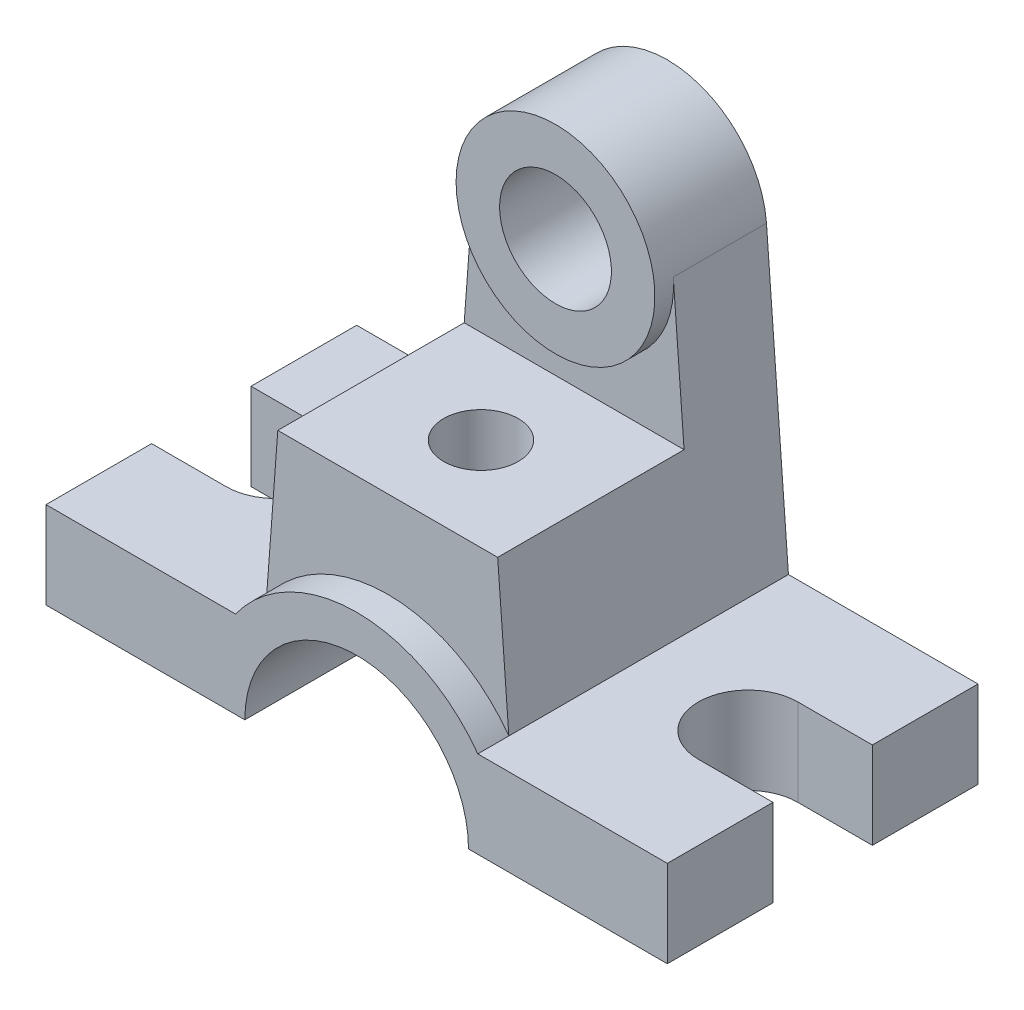
ISO-10303-21;
HEADER;
FILE_DESCRIPTION(('STEP AP214'),'2;1');
FILE_NAME('part.step','',(''),(''),'','','');
FILE_SCHEMA(('AUTOMOTIVE_DESIGN { 1 0 10303 214 1 1 1 1 }'));
ENDSEC;
DATA;
#1=APPLICATION_CONTEXT('core data for automotive mechanical design processes');
#2=APPLICATION_PROTOCOL_DEFINITION('international standard','automotive_design',2000,#1);
#3=PRODUCT_CONTEXT('',#1,'mechanical');
#4=PRODUCT('Part','Part','',(#3));
#5=PRODUCT_RELATED_PRODUCT_CATEGORY('part','',(#4));
#6=PRODUCT_DEFINITION_FORMATION('','',#4);
#7=PRODUCT_DEFINITION_CONTEXT('part definition',#1,'design');
#8=PRODUCT_DEFINITION('design','',#6,#7);
#9=PRODUCT_DEFINITION_SHAPE('','',#8);
#10=(LENGTH_UNIT() NAMED_UNIT(*) SI_UNIT(.MILLI.,.METRE.));
#11=(NAMED_UNIT(*) PLANE_ANGLE_UNIT() SI_UNIT($,.RADIAN.));
#12=(NAMED_UNIT(*) SI_UNIT($,.STERADIAN.) SOLID_ANGLE_UNIT());
#13=UNCERTAINTY_MEASURE_WITH_UNIT(LENGTH_MEASURE(1.E-05),#10,'distance_accuracy_value','');
#14=(GEOMETRIC_REPRESENTATION_CONTEXT(3) GLOBAL_UNCERTAINTY_ASSIGNED_CONTEXT((#13)) GLOBAL_UNIT_ASSIGNED_CONTEXT((#10,
#11,#12)) REPRESENTATION_CONTEXT('',''));
#15=CARTESIAN_POINT('',(0.,0.,0.));
#16=DIRECTION('',(0.,0.,1.));
#17=DIRECTION('',(1.,0.,0.));
#18=AXIS2_PLACEMENT_3D('',#15,#16,#17);
#19=CARTESIAN_POINT('',(0.,0.,-50.));
#20=DIRECTION('',(0.,0.,1.));
#21=DIRECTION('',(1.,0.,0.));
#22=AXIS2_PLACEMENT_3D('',#19,#20,#21);
#23=CYLINDRICAL_SURFACE('',#22,24.);
#24=DIRECTION('',(0.,0.,1.));
#25=VECTOR('',#24,1.);
#26=CARTESIAN_POINT('',(19.4935886896179,14.,-50.));
#27=LINE('',#26,#25);
#28=CARTESIAN_POINT('',(19.4935886896179,14.,-5.));
#29=VERTEX_POINT('',#28);
#30=CARTESIAN_POINT('',(19.4935886896179,14.,0.));
#31=VERTEX_POINT('',#30);
#32=EDGE_CURVE('E409',#29,#31,#27,.T.);
#33=ORIENTED_EDGE('',*,*,#32,.F.);
#34=CARTESIAN_POINT('',(0.,0.,-5.));
#35=DIRECTION('',(0.,0.,-1.));
#36=DIRECTION('',(-1.,0.,0.));
#37=AXIS2_PLACEMENT_3D('',#34,#35,#36);
#38=CIRCLE('',#37,24.);
#39=CARTESIAN_POINT('',(-19.4935886896179,14.,-5.));
#40=VERTEX_POINT('',#39);
#41=EDGE_CURVE('E200',#40,#29,#38,.T.);
#42=ORIENTED_EDGE('',*,*,#41,.F.);
#43=DIRECTION('',(0.,0.,1.));
#44=VECTOR('',#43,1.);
#45=CARTESIAN_POINT('',(-19.4935886896179,14.,-50.));
#46=LINE('',#45,#44);
#47=CARTESIAN_POINT('',(-19.4935886896179,14.,0.));
#48=VERTEX_POINT('',#47);
#49=EDGE_CURVE('E406',#40,#48,#46,.T.);
#50=ORIENTED_EDGE('',*,*,#49,.T.);
#51=CARTESIAN_POINT('',(0.,0.,0.));
#52=DIRECTION('',(0.,0.,1.));
#53=DIRECTION('',(-1.,0.,0.));
#54=AXIS2_PLACEMENT_3D('',#51,#52,#53);
#55=CIRCLE('',#54,24.);
#56=EDGE_CURVE('E391',#31,#48,#55,.T.);
#57=ORIENTED_EDGE('',*,*,#56,.F.);
#58=EDGE_LOOP('',(#33,#42,#50,#57));
#59=FACE_BOUND('',#58,.T.);
#60=ADVANCED_FACE('F47',(#59),#23,.T.);
#61=CARTESIAN_POINT('',(0.,0.,-35.));
#62=DIRECTION('',(0.,0.,-1.));
#63=DIRECTION('',(-1.,0.,0.));
#64=AXIS2_PLACEMENT_3D('',#61,#62,#63);
#65=PLANE('',#64);
#66=DIRECTION('',(-1.,0.,0.));
#67=VECTOR('',#66,1.);
#68=CARTESIAN_POINT('',(0.,38.,-35.));
#69=LINE('',#68,#67);
#70=CARTESIAN_POINT('',(17.6942742704479,38.,-35.));
#71=VERTEX_POINT('',#70);
#72=CARTESIAN_POINT('',(-17.6942742704479,38.,-35.));
#73=VERTEX_POINT('',#72);
#74=EDGE_CURVE('E11',#71,#73,#69,.T.);
#75=ORIENTED_EDGE('',*,*,#74,.F.);
#76=DIRECTION('',(-0.0747616216240642,0.997201433980187,0.));
#77=VECTOR('',#76,1.);
#78=CARTESIAN_POINT('',(20.428366721095,1.53154395005661,-35.));
#79=LINE('',#78,#77);
#80=CARTESIAN_POINT('',(15.955222943683,61.196185945985,-35.));
#81=VERTEX_POINT('',#80);
#82=EDGE_CURVE('E208',#71,#81,#79,.T.);
#83=ORIENTED_EDGE('',*,*,#82,.T.);
#84=CARTESIAN_POINT('',(0.,60.,-35.));
#85=DIRECTION('',(0.,0.,-1.));
#86=DIRECTION('',(-1.,0.,0.));
#87=AXIS2_PLACEMENT_3D('',#84,#85,#86);
#88=CIRCLE('',#87,16.);
#89=CARTESIAN_POINT('',(-15.955222943683,61.196185945985,-35.));
#90=VERTEX_POINT('',#89);
#91=EDGE_CURVE('E247',#81,#90,#88,.T.);
#92=ORIENTED_EDGE('',*,*,#91,.T.);
#93=DIRECTION('',(0.0747616216240642,0.997201433980187,0.));
#94=VECTOR('',#93,1.);
#95=CARTESIAN_POINT('',(-20.428366721095,1.53154395005661,-35.));
#96=LINE('',#95,#94);
#97=EDGE_CURVE('E268',#73,#90,#96,.T.);
#98=ORIENTED_EDGE('',*,*,#97,.F.);
#99=EDGE_LOOP('',(#75,#83,#92,#98));
#100=FACE_BOUND('',#99,.T.);
#101=ADVANCED_FACE('F511',(#100),#65,.F.);
#102=CARTESIAN_POINT('',(-50.,0.,-50.));
#103=DIRECTION('',(-1.,0.,0.));
#104=DIRECTION('',(0.,0.,1.));
#105=AXIS2_PLACEMENT_3D('',#102,#103,#104);
#106=PLANE('',#105);
#107=DIRECTION('',(0.,-1.,0.));
#108=VECTOR('',#107,1.);
#109=CARTESIAN_POINT('',(-50.,0.,-33.));
#110=LINE('',#109,#108);
#111=CARTESIAN_POINT('',(-50.,14.,-33.));
#112=VERTEX_POINT('',#111);
#113=CARTESIAN_POINT('',(-50.,0.,-33.));
#114=VERTEX_POINT('',#113);
#115=EDGE_CURVE('E329',#112,#114,#110,.T.);
#116=ORIENTED_EDGE('',*,*,#115,.F.);
#117=DIRECTION('',(0.,0.,1.));
#118=VECTOR('',#117,1.);
#119=CARTESIAN_POINT('',(-50.,14.,-50.));
#120=LINE('',#119,#118);
#121=CARTESIAN_POINT('',(-50.,14.,-50.));
#122=VERTEX_POINT('',#121);
#123=EDGE_CURVE('E398',#122,#112,#120,.T.);
#124=ORIENTED_EDGE('',*,*,#123,.F.);
#125=DIRECTION('',(0.,-1.,0.));
#126=VECTOR('',#125,1.);
#127=CARTESIAN_POINT('',(-50.,0.,-50.));
#128=LINE('',#127,#126);
#129=CARTESIAN_POINT('',(-50.,0.,-50.));
#130=VERTEX_POINT('',#129);
#131=EDGE_CURVE('E339',#122,#130,#128,.T.);
#132=ORIENTED_EDGE('',*,*,#131,.T.);
#133=DIRECTION('',(0.,0.,1.));
#134=VECTOR('',#133,1.);
#135=CARTESIAN_POINT('',(-50.,0.,-50.));
#136=LINE('',#135,#134);
#137=EDGE_CURVE('E426',#130,#114,#136,.T.);
#138=ORIENTED_EDGE('',*,*,#137,.T.);
#139=EDGE_LOOP('',(#116,#124,#132,#138));
#140=FACE_BOUND('',#139,.T.);
#141=ADVANCED_FACE('F461',(#140),#106,.T.);
#142=CARTESIAN_POINT('',(50.,0.,-50.));
#143=DIRECTION('',(1.,0.,0.));
#144=DIRECTION('',(0.,0.,-1.));
#145=AXIS2_PLACEMENT_3D('',#142,#143,#144);
#146=PLANE('',#145);
#147=DIRECTION('',(0.,-1.,0.));
#148=VECTOR('',#147,1.);
#149=CARTESIAN_POINT('',(50.,0.,-17.));
#150=LINE('',#149,#148);
#151=CARTESIAN_POINT('',(50.,14.,-17.));
#152=VERTEX_POINT('',#151);
#153=CARTESIAN_POINT('',(50.,0.,-17.));
#154=VERTEX_POINT('',#153);
#155=EDGE_CURVE('E335',#152,#154,#150,.T.);
#156=ORIENTED_EDGE('',*,*,#155,.F.);
#157=DIRECTION('',(0.,0.,1.));
#158=VECTOR('',#157,1.);
#159=CARTESIAN_POINT('',(50.,14.,-50.));
#160=LINE('',#159,#158);
#161=CARTESIAN_POINT('',(50.,14.,0.));
#162=VERTEX_POINT('',#161);
#163=EDGE_CURVE('E414',#152,#162,#160,.T.);
#164=ORIENTED_EDGE('',*,*,#163,.T.);
#165=DIRECTION('',(0.,1.,0.));
#166=VECTOR('',#165,1.);
#167=CARTESIAN_POINT('',(50.,0.,0.));
#168=LINE('',#167,#166);
#169=CARTESIAN_POINT('',(50.,0.,0.));
#170=VERTEX_POINT('',#169);
#171=EDGE_CURVE('E383',#170,#162,#168,.T.);
#172=ORIENTED_EDGE('',*,*,#171,.F.);
#173=DIRECTION('',(0.,0.,1.));
#174=VECTOR('',#173,1.);
#175=CARTESIAN_POINT('',(50.,0.,-50.));
#176=LINE('',#175,#174);
#177=EDGE_CURVE('E419',#154,#170,#176,.T.);
#178=ORIENTED_EDGE('',*,*,#177,.F.);
#179=EDGE_LOOP('',(#156,#164,#172,#178));
#180=FACE_BOUND('',#179,.T.);
#181=ADVANCED_FACE('F485',(#180),#146,.T.);
#182=DIRECTION('',(0.,1.,0.));
#183=VECTOR('',#182,1.);
#184=CARTESIAN_POINT('',(-50.,0.,-17.));
#185=LINE('',#184,#183);
#186=CARTESIAN_POINT('',(-50.,0.,-17.));
#187=VERTEX_POINT('',#186);
#188=CARTESIAN_POINT('',(-50.,14.,-17.));
#189=VERTEX_POINT('',#188);
#190=EDGE_CURVE('E300',#187,#189,#185,.T.);
#191=ORIENTED_EDGE('',*,*,#190,.F.);
#192=CARTESIAN_POINT('',(-50.,0.,0.));
#193=VERTEX_POINT('',#192);
#194=EDGE_CURVE('E367',#187,#193,#136,.T.);
#195=ORIENTED_EDGE('',*,*,#194,.T.);
#196=DIRECTION('',(0.,-1.,0.));
#197=VECTOR('',#196,1.);
#198=CARTESIAN_POINT('',(-50.,0.,0.));
#199=LINE('',#198,#197);
#200=CARTESIAN_POINT('',(-50.,14.,0.));
#201=VERTEX_POINT('',#200);
#202=EDGE_CURVE('E338',#201,#193,#199,.T.);
#203=ORIENTED_EDGE('',*,*,#202,.F.);
#204=EDGE_CURVE('E403',#189,#201,#120,.T.);
#205=ORIENTED_EDGE('',*,*,#204,.F.);
#206=EDGE_LOOP('',(#191,#195,#203,#205));
#207=FACE_BOUND('',#206,.T.);
#208=ADVANCED_FACE('F49',(#207),#106,.T.);
#209=CARTESIAN_POINT('',(-50.,14.,-50.));
#210=DIRECTION('',(0.,1.,0.));
#211=DIRECTION('',(-1.,0.,0.));
#212=AXIS2_PLACEMENT_3D('',#209,#210,#211);
#213=PLANE('',#212);
#214=DIRECTION('',(-1.,0.,0.));
#215=VECTOR('',#214,1.);
#216=CARTESIAN_POINT('',(-62.,14.,-33.));
#217=LINE('',#216,#215);
#218=CARTESIAN_POINT('',(-38.,14.,-33.));
#219=VERTEX_POINT('',#218);
#220=EDGE_CURVE('E282',#219,#112,#217,.T.);
#221=ORIENTED_EDGE('',*,*,#220,.F.);
#222=CARTESIAN_POINT('',(-38.,14.,-25.));
#223=DIRECTION('',(0.,1.,0.));
#224=DIRECTION('',(-1.,0.,0.));
#225=AXIS2_PLACEMENT_3D('',#222,#223,#224);
#226=CIRCLE('',#225,8.00000000000001);
#227=CARTESIAN_POINT('',(-38.,14.,-17.));
#228=VERTEX_POINT('',#227);
#229=EDGE_CURVE('E290',#228,#219,#226,.T.);
#230=ORIENTED_EDGE('',*,*,#229,.F.);
#231=DIRECTION('',(1.,0.,0.));
#232=VECTOR('',#231,1.);
#233=CARTESIAN_POINT('',(-62.,14.,-17.));
#234=LINE('',#233,#232);
#235=EDGE_CURVE('E287',#189,#228,#234,.T.);
#236=ORIENTED_EDGE('',*,*,#235,.F.);
#237=ORIENTED_EDGE('',*,*,#204,.T.);
#238=DIRECTION('',(-1.,0.,0.));
#239=VECTOR('',#238,1.);
#240=CARTESIAN_POINT('',(-50.,14.,0.));
#241=LINE('',#240,#239);
#242=EDGE_CURVE('E344',#48,#201,#241,.T.);
#243=ORIENTED_EDGE('',*,*,#242,.F.);
#244=ORIENTED_EDGE('',*,*,#49,.F.);
#245=CARTESIAN_POINT('',(-19.4935886896179,14.,-50.));
#246=VERTEX_POINT('',#245);
#247=EDGE_CURVE('E63',#246,#40,#46,.T.);
#248=ORIENTED_EDGE('',*,*,#247,.F.);
#249=DIRECTION('',(-1.,0.,0.));
#250=VECTOR('',#249,1.);
#251=CARTESIAN_POINT('',(-50.,14.,-50.));
#252=LINE('',#251,#250);
#253=EDGE_CURVE('E363',#246,#122,#252,.T.);
#254=ORIENTED_EDGE('',*,*,#253,.T.);
#255=ORIENTED_EDGE('',*,*,#123,.T.);
#256=EDGE_LOOP('',(#221,#230,#236,#237,#243,#244,#248,#254,#255));
#257=FACE_BOUND('',#256,.T.);
#258=ADVANCED_FACE('F464',(#257),#213,.T.);
#259=CARTESIAN_POINT('',(50.,14.,-50.));
#260=DIRECTION('',(0.,1.,0.));
#261=DIRECTION('',(-1.,0.,0.));
#262=AXIS2_PLACEMENT_3D('',#259,#260,#261);
#263=PLANE('',#262);
#264=DIRECTION('',(1.,0.,0.));
#265=VECTOR('',#264,1.);
#266=CARTESIAN_POINT('',(62.,14.,-17.));
#267=LINE('',#266,#265);
#268=CARTESIAN_POINT('',(38.,14.,-17.));
#269=VERTEX_POINT('',#268);
#270=EDGE_CURVE('E311',#269,#152,#267,.T.);
#271=ORIENTED_EDGE('',*,*,#270,.F.);
#272=CARTESIAN_POINT('',(38.,14.,-25.));
#273=DIRECTION('',(0.,1.,0.));
#274=DIRECTION('',(1.,0.,0.));
#275=AXIS2_PLACEMENT_3D('',#272,#273,#274);
#276=CIRCLE('',#275,8.);
#277=CARTESIAN_POINT('',(38.,14.,-33.));
#278=VERTEX_POINT('',#277);
#279=EDGE_CURVE('E314',#278,#269,#276,.T.);
#280=ORIENTED_EDGE('',*,*,#279,.F.);
#281=DIRECTION('',(-1.,0.,0.));
#282=VECTOR('',#281,1.);
#283=CARTESIAN_POINT('',(62.,14.,-33.));
#284=LINE('',#283,#282);
#285=CARTESIAN_POINT('',(50.,14.,-33.));
#286=VERTEX_POINT('',#285);
#287=EDGE_CURVE('E291',#286,#278,#284,.T.);
#288=ORIENTED_EDGE('',*,*,#287,.F.);
#289=CARTESIAN_POINT('',(50.,14.,-50.));
#290=VERTEX_POINT('',#289);
#291=EDGE_CURVE('E410',#290,#286,#160,.T.);
#292=ORIENTED_EDGE('',*,*,#291,.F.);
#293=DIRECTION('',(-1.,0.,0.));
#294=VECTOR('',#293,1.);
#295=CARTESIAN_POINT('',(50.,14.,-50.));
#296=LINE('',#295,#294);
#297=CARTESIAN_POINT('',(19.4935886896179,14.,-50.));
#298=VERTEX_POINT('',#297);
#299=EDGE_CURVE('E360',#290,#298,#296,.T.);
#300=ORIENTED_EDGE('',*,*,#299,.T.);
#301=EDGE_CURVE('E71',#298,#29,#27,.T.);
#302=ORIENTED_EDGE('',*,*,#301,.T.);
#303=ORIENTED_EDGE('',*,*,#32,.T.);
#304=DIRECTION('',(-1.,0.,0.));
#305=VECTOR('',#304,1.);
#306=CARTESIAN_POINT('',(50.,14.,0.));
#307=LINE('',#306,#305);
#308=EDGE_CURVE('E387',#162,#31,#307,.T.);
#309=ORIENTED_EDGE('',*,*,#308,.F.);
#310=ORIENTED_EDGE('',*,*,#163,.F.);
#311=EDGE_LOOP('',(#271,#280,#288,#292,#300,#302,#303,#309,#310));
#312=FACE_BOUND('',#311,.T.);
#313=ADVANCED_FACE('F475',(#312),#263,.T.);
#314=DIRECTION('',(0.,1.,0.));
#315=VECTOR('',#314,1.);
#316=CARTESIAN_POINT('',(50.,0.,-33.));
#317=LINE('',#316,#315);
#318=CARTESIAN_POINT('',(50.,0.,-33.));
#319=VERTEX_POINT('',#318);
#320=EDGE_CURVE('E332',#319,#286,#317,.T.);
#321=ORIENTED_EDGE('',*,*,#320,.F.);
#322=CARTESIAN_POINT('',(50.,0.,-50.));
#323=VERTEX_POINT('',#322);
#324=EDGE_CURVE('E415',#323,#319,#176,.T.);
#325=ORIENTED_EDGE('',*,*,#324,.F.);
#326=DIRECTION('',(0.,1.,0.));
#327=VECTOR('',#326,1.);
#328=CARTESIAN_POINT('',(50.,0.,-50.));
#329=LINE('',#328,#327);
#330=EDGE_CURVE('E356',#323,#290,#329,.T.);
#331=ORIENTED_EDGE('',*,*,#330,.T.);
#332=ORIENTED_EDGE('',*,*,#291,.T.);
#333=EDGE_LOOP('',(#321,#325,#331,#332));
#334=FACE_BOUND('',#333,.T.);
#335=ADVANCED_FACE('F440',(#334),#146,.T.);
#336=CARTESIAN_POINT('',(50.,0.,-50.));
#337=DIRECTION('',(0.,-1.,0.));
#338=DIRECTION('',(0.,0.,-1.));
#339=AXIS2_PLACEMENT_3D('',#336,#337,#338);
#340=PLANE('',#339);
#341=DIRECTION('',(1.,0.,0.));
#342=VECTOR('',#341,1.);
#343=CARTESIAN_POINT('',(62.,0.,-17.));
#344=LINE('',#343,#342);
#345=CARTESIAN_POINT('',(38.,0.,-17.));
#346=VERTEX_POINT('',#345);
#347=EDGE_CURVE('E308',#346,#154,#344,.T.);
#348=ORIENTED_EDGE('',*,*,#347,.T.);
#349=ORIENTED_EDGE('',*,*,#177,.T.);
#350=DIRECTION('',(1.,0.,0.));
#351=VECTOR('',#350,1.);
#352=CARTESIAN_POINT('',(50.,0.,0.));
#353=LINE('',#352,#351);
#354=CARTESIAN_POINT('',(18.,0.,0.));
#355=VERTEX_POINT('',#354);
#356=EDGE_CURVE('E379',#355,#170,#353,.T.);
#357=ORIENTED_EDGE('',*,*,#356,.F.);
#358=DIRECTION('',(0.,0.,1.));
#359=VECTOR('',#358,1.);
#360=CARTESIAN_POINT('',(18.,0.,-50.));
#361=LINE('',#360,#359);
#362=CARTESIAN_POINT('',(18.,0.,-50.));
#363=VERTEX_POINT('',#362);
#364=EDGE_CURVE('E420',#363,#355,#361,.T.);
#365=ORIENTED_EDGE('',*,*,#364,.F.);
#366=DIRECTION('',(1.,0.,0.));
#367=VECTOR('',#366,1.);
#368=CARTESIAN_POINT('',(50.,0.,-50.));
#369=LINE('',#368,#367);
#370=EDGE_CURVE('E352',#363,#323,#369,.T.);
#371=ORIENTED_EDGE('',*,*,#370,.T.);
#372=ORIENTED_EDGE('',*,*,#324,.T.);
#373=DIRECTION('',(1.,0.,0.));
#374=VECTOR('',#373,1.);
#375=CARTESIAN_POINT('',(50.,0.,-33.));
#376=LINE('',#375,#374);
#377=CARTESIAN_POINT('',(38.,0.,-33.));
#378=VERTEX_POINT('',#377);
#379=EDGE_CURVE('E56',#378,#319,#376,.T.);
#380=ORIENTED_EDGE('',*,*,#379,.F.);
#381=CARTESIAN_POINT('',(38.,0.,-25.));
#382=DIRECTION('',(0.,1.,0.));
#383=DIRECTION('',(1.,0.,0.));
#384=AXIS2_PLACEMENT_3D('',#381,#382,#383);
#385=CIRCLE('',#384,8.);
#386=EDGE_CURVE('E315',#378,#346,#385,.T.);
#387=ORIENTED_EDGE('',*,*,#386,.T.);
#388=EDGE_LOOP('',(#348,#349,#357,#365,#371,#372,#380,#387));
#389=FACE_BOUND('',#388,.T.);
#390=ADVANCED_FACE('F442',(#389),#340,.T.);
#391=CARTESIAN_POINT('',(0.,0.,-50.));
#392=DIRECTION('',(0.,0.,1.));
#393=DIRECTION('',(1.,0.,0.));
#394=AXIS2_PLACEMENT_3D('',#391,#392,#393);
#395=CYLINDRICAL_SURFACE('',#394,18.);
#396=CARTESIAN_POINT('',(0.,18.,-14.));
#397=CARTESIAN_POINT('',(-0.327379650289658,18.000001123506,-13.9999976734953));
#398=CARTESIAN_POINT('',(-0.654748688533564,17.9909867942918,-14.0268792948225));
#399=CARTESIAN_POINT('',(-1.29985304419291,17.9559119882929,-14.133376955083));
#400=CARTESIAN_POINT('',(-1.61758735790783,17.9298497418759,-14.2129984686087));
#401=CARTESIAN_POINT('',(-2.23398736346928,17.8635207608215,-14.4219070694017));
#402=CARTESIAN_POINT('',(-2.53268396310175,17.8232777801419,-14.5511111336334));
#403=CARTESIAN_POINT('',(-3.1042846199529,17.7326582250689,-14.8552782843184));
#404=CARTESIAN_POINT('',(-3.37718357480982,17.6822796521554,-15.0302503972886));
#405=CARTESIAN_POINT('',(-3.76616319556052,17.6021139762513,-15.3262660620988));
#406=CARTESIAN_POINT('',(-3.8942294180292,17.5741584828372,-15.432437529435));
#407=CARTESIAN_POINT('',(-4.14103139160447,17.5176437471481,-15.6549543367563));
#408=CARTESIAN_POINT('',(-4.25977020760166,17.4890847071399,-15.7712963080436));
#409=CARTESIAN_POINT('',(-4.48726302616457,17.4321038412202,-16.0135098640188));
#410=CARTESIAN_POINT('',(-4.59601129158695,17.4036821029209,-16.1393868494923));
#411=CARTESIAN_POINT('',(-4.80273826983802,17.3477712002834,-16.399815157792));
#412=CARTESIAN_POINT('',(-4.90072088829396,17.3202817002612,-16.5343633065478));
#413=CARTESIAN_POINT('',(-5.08800724585022,17.2662087032665,-16.8154236228712));
#414=CARTESIAN_POINT('',(-5.17697354503101,17.2396751826829,-16.9621705532801));
#415=CARTESIAN_POINT('',(-5.34214016777294,17.1892116232901,-17.263035363574));
#416=CARTESIAN_POINT('',(-5.41834554335251,17.165280555498,-17.4171502952737));
#417=CARTESIAN_POINT('',(-5.55741169583796,17.1207625674418,-17.7317928068148));
#418=CARTESIAN_POINT('',(-5.62027009739616,17.1001762425913,-17.892321522081));
#419=CARTESIAN_POINT('',(-5.73202691492453,17.0630401245342,-18.2185458557252));
#420=CARTESIAN_POINT('',(-5.78093169214337,17.0464884924745,-18.384239081342));
#421=CARTESIAN_POINT('',(-5.86294638495678,17.0184510407943,-18.7140137931498));
#422=CARTESIAN_POINT('',(-5.89652807287008,17.0068148729862,-18.8779651895639));
#423=CARTESIAN_POINT('',(-5.94988922941376,16.9882200160252,-19.208295772068));
#424=CARTESIAN_POINT('',(-5.96967445275638,16.981259376684,-19.3746739163244));
#425=CARTESIAN_POINT('',(-5.99526000389046,16.972243291642,-19.7086235974658));
#426=CARTESIAN_POINT('',(-6.00106129575104,16.9701875077948,-19.8761950512836));
#427=CARTESIAN_POINT('',(-5.99862030680244,16.9710505580303,-20.2112202646035));
#428=CARTESIAN_POINT('',(-5.99037842226283,16.9739692517434,-20.3786740272933));
#429=CARTESIAN_POINT('',(-5.96063984942073,16.9844341754675,-20.7044792823855));
#430=CARTESIAN_POINT('',(-5.93976958041475,16.9917616219287,-20.8628954801507));
#431=CARTESIAN_POINT('',(-5.88551353932247,17.0106306342449,-21.1773689979507));
#432=CARTESIAN_POINT('',(-5.8521235554091,17.0221736182384,-21.3334255057481));
#433=CARTESIAN_POINT('',(-5.7731374155462,17.0491237940853,-21.6420252766195));
#434=CARTESIAN_POINT('',(-5.72754467937086,17.0645299032367,-21.794569511007));
#435=CARTESIAN_POINT('',(-5.62451111134525,17.0987666198765,-22.0952671602652));
#436=CARTESIAN_POINT('',(-5.56706578060239,17.1175985273741,-22.2434188833764));
#437=CARTESIAN_POINT('',(-5.43978996961935,17.1584737023369,-22.5366577606339));
#438=CARTESIAN_POINT('',(-5.36977902106655,17.1805627911335,-22.6816601509577));
#439=CARTESIAN_POINT('',(-5.21849496708249,17.2271173682882,-22.9653261210285));
#440=CARTESIAN_POINT('',(-5.13721801376243,17.2515836677221,-23.1039875134049));
#441=CARTESIAN_POINT('',(-4.96396506342481,17.3022308894506,-23.3741372493203));
#442=CARTESIAN_POINT('',(-4.87198833374048,17.3284119291083,-23.5056251007447));
#443=CARTESIAN_POINT('',(-4.67791711233442,17.3818071133135,-23.7606879926457));
#444=CARTESIAN_POINT('',(-4.57582226284313,17.4090212943713,-23.8842627530665));
#445=CARTESIAN_POINT('',(-4.3565109216762,17.4652307681598,-24.1290695246608));
#446=CARTESIAN_POINT('',(-4.23878222552779,17.4942446291105,-24.2498389207991));
#447=CARTESIAN_POINT('',(-3.99356544234078,17.5518457645375,-24.4810517484013));
#448=CARTESIAN_POINT('',(-3.8660804423721,17.5804331705585,-24.5914984217909));
#449=CARTESIAN_POINT('',(-3.60203839398285,17.6364264431102,-24.8014351482675));
#450=CARTESIAN_POINT('',(-3.46547705844155,17.66383174106,-24.900919963808));
#451=CARTESIAN_POINT('',(-3.18424141551367,17.716688947922,-25.0881362589834));
#452=CARTESIAN_POINT('',(-3.03957034912589,17.7421416276874,-25.1758723870614));
#453=CARTESIAN_POINT('',(-2.74144779789668,17.7906577486565,-25.3398221802258));
#454=CARTESIAN_POINT('',(-2.58792073088706,17.8136936325711,-25.4159067222553));
#455=CARTESIAN_POINT('',(-2.27458592506743,17.8564062976005,-25.5547828197253));
#456=CARTESIAN_POINT('',(-2.11478068961971,17.8760844012064,-25.6175796110126));
#457=CARTESIAN_POINT('',(-1.78999322259957,17.9115215641534,-25.7293468758217));
#458=CARTESIAN_POINT('',(-1.62501139705281,17.9272809299996,-25.7783184307282));
#459=CARTESIAN_POINT('',(-1.29111086658729,17.954416785468,-25.8619664001444));
#460=CARTESIAN_POINT('',(-1.12219234324136,17.9657934768103,-25.8966434725873));
#461=CARTESIAN_POINT('',(-0.789168788155051,17.9834311786537,-25.9501600950611));
#462=CARTESIAN_POINT('',(-0.625174437128373,17.9898933737321,-25.9696235189645));
#463=CARTESIAN_POINT('',(-0.295964203150349,17.9983200246332,-25.9949702312331));
#464=CARTESIAN_POINT('',(-0.130747919465908,18.0002829327427,-26.0008488465555));
#465=CARTESIAN_POINT('',(0.199509552434275,17.9996513983649,-25.9989541453477));
#466=CARTESIAN_POINT('',(0.364550787039308,17.9970593541922,-25.9911880131744));
#467=CARTESIAN_POINT('',(0.693361592702051,17.9873931413008,-25.9620885836536));
#468=CARTESIAN_POINT('',(0.857130672286741,17.9803173198124,-25.9407502834448));
#469=CARTESIAN_POINT('',(1.17733651912545,17.9621501229369,-25.885532591795));
#470=CARTESIAN_POINT('',(1.333847311531,17.9511829004167,-25.8520402886701));
#471=CARTESIAN_POINT('',(1.64345814456252,17.9254899139335,-25.7727458266411));
#472=CARTESIAN_POINT('',(1.79655695572468,17.910762818218,-25.7269393057176));
#473=CARTESIAN_POINT('',(2.0982565498418,17.8779285210375,-25.6234099296325));
#474=CARTESIAN_POINT('',(2.24685853242727,17.8598222304539,-25.5656902852788));
#475=CARTESIAN_POINT('',(2.53870192503154,17.8206824064423,-25.4387820388284));
#476=CARTESIAN_POINT('',(2.68194138840116,17.7996478228409,-25.3695893204365));
#477=CARTESIAN_POINT('',(3.10955308705347,17.7317545667084,-25.1416569466014));
#478=CARTESIAN_POINT('',(3.38410495409261,17.6809813742354,-24.9652088096921));
#479=CARTESIAN_POINT('',(3.90046380489826,17.5743027422684,-24.57077871329));
#480=CARTESIAN_POINT('',(4.14226074948703,17.5183957380628,-24.3527840691061));
#481=CARTESIAN_POINT('',(4.4812007541006,17.4336826212657,-23.9934553932898));
#482=CARTESIAN_POINT('',(4.59235115980604,17.4046627531,-23.8651188368404));
#483=CARTESIAN_POINT('',(4.80346249277618,17.3475844522084,-23.5993761780772));
#484=CARTESIAN_POINT('',(4.90342734427859,17.3195256847111,-23.4619732835788));
#485=CARTESIAN_POINT('',(5.09152241657997,17.2651671618791,-23.1788835354438));
#486=CARTESIAN_POINT('',(5.17964753663557,17.2388681671158,-23.0331931496532));
#487=CARTESIAN_POINT('',(5.34332580832151,17.1888391626455,-22.7345648194739));
#488=CARTESIAN_POINT('',(5.41888421002775,17.1651080815805,-22.5816299361471));
#489=CARTESIAN_POINT('',(5.5567432565725,17.1209765842434,-22.2697205755499));
#490=CARTESIAN_POINT('',(5.61906451465576,17.1005710011209,-22.1107559498054));
#491=CARTESIAN_POINT('',(5.73001985812798,17.0637127452484,-21.78774169754));
#492=CARTESIAN_POINT('',(5.77865956483043,17.047258449448,-21.6236941902597));
#493=CARTESIAN_POINT('',(5.86180765260836,17.0188467426427,-21.291699944474));
#494=CARTESIAN_POINT('',(5.89631843745227,17.0068885667365,-21.123753874377));
#495=CARTESIAN_POINT('',(5.95086210077737,16.9878803440502,-20.7852545842208));
#496=CARTESIAN_POINT('',(5.97089570887972,16.980830049923,-20.6147014959926));
#497=CARTESIAN_POINT('',(5.99561670735591,16.9721165300556,-20.2812106882564));
#498=CARTESIAN_POINT('',(6.00104252908573,16.9701941359793,-20.1183340537796));
#499=CARTESIAN_POINT('',(5.9986271857483,16.971048132718,-19.7926337230625));
#500=CARTESIAN_POINT('',(5.99078151118914,16.9738261206655,-19.6298100636262));
#501=CARTESIAN_POINT('',(5.96189837770532,16.9839924705695,-19.3055569116172));
#502=CARTESIAN_POINT('',(5.94086667700384,16.9913788200877,-19.1441268416548));
#503=CARTESIAN_POINT('',(5.88580987344675,17.010528799585,-18.8237014690053));
#504=CARTESIAN_POINT('',(5.85177988955101,17.02229407387,-18.6647071043166));
#505=CARTESIAN_POINT('',(5.77182751147199,17.0495675106714,-18.3533873239949));
#506=CARTESIAN_POINT('',(5.72614898895513,17.0649985214979,-18.2009923566864));
#507=CARTESIAN_POINT('',(5.62296574413082,17.0992751394136,-17.9005983806455));
#508=CARTESIAN_POINT('',(5.56545681111227,17.1181219619827,-17.7526009586223));
#509=CARTESIAN_POINT('',(5.43907961849348,17.1586949560773,-17.4619860005742));
#510=CARTESIAN_POINT('',(5.37021353557005,17.1804205757049,-17.3193674400761));
#511=CARTESIAN_POINT('',(5.2215810809329,17.2261759837312,-17.0402525364223));
#512=CARTESIAN_POINT('',(5.1418105631617,17.2502066475064,-16.9037585482827));
#513=CARTESIAN_POINT('',(4.96822239816027,17.3010197763056,-16.6319333532983));
#514=CARTESIAN_POINT('',(4.87394621391852,17.3278763260538,-16.4969081466045));
#515=CARTESIAN_POINT('',(4.67473803525016,17.3826786842874,-16.2351740540562));
#516=CARTESIAN_POINT('',(4.56980207786682,17.4106248954769,-16.1084682901331));
#517=CARTESIAN_POINT('',(4.23997033318675,17.4949712765604,-15.7420091934132));
#518=CARTESIAN_POINT('',(3.99991932392137,17.5519192865978,-15.5157089233649));
#519=CARTESIAN_POINT('',(3.47541732325491,17.6634103595779,-15.0970915751166));
#520=CARTESIAN_POINT('',(3.18960052896,17.7177731925948,-14.9064426794846));
#521=CARTESIAN_POINT('',(2.5881526942897,17.815557186422,-14.5760686580308));
#522=CARTESIAN_POINT('',(2.27252930193346,17.8589811435868,-14.4363305135776));
#523=CARTESIAN_POINT('',(1.63495978805022,17.9283314877085,-14.2176673495037));
#524=CARTESIAN_POINT('',(1.31392615559421,17.9549529431752,-14.1363042853183));
#525=CARTESIAN_POINT('',(0.661922886417796,17.9907842260842,-14.0274792327852));
#526=CARTESIAN_POINT('',(0.330956020624388,17.9999988642206,-14.0000023519199));
#527=CARTESIAN_POINT('',(0.,18.,-14.));
#528=B_SPLINE_CURVE_WITH_KNOTS('',3,(#396,#397,#398,#399,#400,#401,#402,#403,#404,#405,#406,
#407,#408,#409,#410,#411,#412,#413,#414,#415,#416,#417,#418,#419,#420,#421,#422,#423,#424,#425,
#426,#427,#428,#429,#430,#431,#432,#433,#434,#435,#436,#437,#438,#439,#440,#441,#442,#443,#444,
#445,#446,#447,#448,#449,#450,#451,#452,#453,#454,#455,#456,#457,#458,#459,#460,#461,#462,#463,
#464,#465,#466,#467,#468,#469,#470,#471,#472,#473,#474,#475,#476,#477,#478,#479,#480,#481,#482,
#483,#484,#485,#486,#487,#488,#489,#490,#491,#492,#493,#494,#495,#496,#497,#498,#499,#500,#501,
#502,#503,#504,#505,#506,#507,#508,#509,#510,#511,#512,#513,#514,#515,#516,#517,#518,#519,#520,
#521,#522,#523,#524,#525,#526,#527),.UNSPECIFIED.,.T.,.F.,(4,2,2,2,2,2,2,2,2,2,2,2,2,2,2,2,2,2,
2,2,2,2,2,2,2,2,2,2,2,2,2,2,2,2,2,2,2,2,2,2,2,2,2,2,2,2,2,2,2,2,2,2,2,2,2,2,2,2,2,2,2,2,2,2,2,
4),(0.,0.980922636156066,1.96194711160512,2.94133603722164,3.9209182667946,4.42650795800366,
4.93193081656492,5.43764212680676,5.94316936197255,6.46347458360146,6.9835733281568,
7.50376455673091,8.02371825760201,8.52635611322413,9.02878418544483,9.53117761867721,
10.0335568756344,10.5128532711172,10.9923110542534,11.4716346116346,11.9511404417982,
12.4381827239462,12.9253917665144,13.4126341903617,13.8998938489077,14.4127033790737,
14.9253513126936,15.4382431356103,15.9509314262095,16.4689439882804,16.9867520532929,
17.5045196050784,18.022263322881,18.517462598168,19.0128321918785,19.5079410372374,
20.003232491415,20.4839646652066,20.9648673518609,21.4456405951741,21.9265867044307,
22.9127919780086,23.8992988366979,24.4155088763845,24.931537242041,25.4477872128305,
25.9638209619367,26.4790451400542,26.9940573187272,27.5089818413856,28.0238804110535,
28.5122138127281,29.0007131774442,29.4889993671701,29.9774690958509,30.4564495222616,
30.9356007245367,31.4146602006446,31.8939023328471,32.393886068824,32.8940563675104,
33.8936650334288,34.9322320161082,35.9705332351495,36.9624458684309,37.9540843282905),.UNSPECIFIED.);
#529=CARTESIAN_POINT('',(0.,18.,-14.));
#530=VERTEX_POINT('',#529);
#531=EDGE_CURVE('E218',#530,#530,#528,.T.);
#532=ORIENTED_EDGE('',*,*,#531,.F.);
#533=EDGE_LOOP('',(#532));
#534=FACE_BOUND('',#533,.T.);
#535=CARTESIAN_POINT('',(0.,0.,0.));
#536=DIRECTION('',(0.,0.,-1.));
#537=DIRECTION('',(-1.,0.,0.));
#538=AXIS2_PLACEMENT_3D('',#535,#536,#537);
#539=CIRCLE('',#538,18.);
#540=CARTESIAN_POINT('',(-18.,0.,0.));
#541=VERTEX_POINT('',#540);
#542=EDGE_CURVE('E375',#541,#355,#539,.T.);
#543=ORIENTED_EDGE('',*,*,#542,.F.);
#544=DIRECTION('',(0.,0.,1.));
#545=VECTOR('',#544,1.);
#546=CARTESIAN_POINT('',(-18.,0.,-50.));
#547=LINE('',#546,#545);
#548=CARTESIAN_POINT('',(-18.,0.,-50.));
#549=VERTEX_POINT('',#548);
#550=EDGE_CURVE('E423',#549,#541,#547,.T.);
#551=ORIENTED_EDGE('',*,*,#550,.F.);
#552=CARTESIAN_POINT('',(0.,0.,-50.));
#553=DIRECTION('',(0.,0.,-1.));
#554=DIRECTION('',(-1.,0.,0.));
#555=AXIS2_PLACEMENT_3D('',#552,#553,#554);
#556=CIRCLE('',#555,18.);
#557=EDGE_CURVE('E348',#549,#363,#556,.T.);
#558=ORIENTED_EDGE('',*,*,#557,.T.);
#559=ORIENTED_EDGE('',*,*,#364,.T.);
#560=EDGE_LOOP('',(#543,#551,#558,#559));
#561=FACE_BOUND('',#560,.T.);
#562=ADVANCED_FACE('F453',(#534,#561),#395,.F.);
#563=CARTESIAN_POINT('',(-50.,0.,-50.));
#564=DIRECTION('',(0.,-1.,0.));
#565=DIRECTION('',(0.,0.,-1.));
#566=AXIS2_PLACEMENT_3D('',#563,#564,#565);
#567=PLANE('',#566);
#568=DIRECTION('',(-1.,0.,0.));
#569=VECTOR('',#568,1.);
#570=CARTESIAN_POINT('',(-62.,0.,-33.));
#571=LINE('',#570,#569);
#572=CARTESIAN_POINT('',(-38.,0.,-33.));
#573=VERTEX_POINT('',#572);
#574=EDGE_CURVE('E281',#573,#114,#571,.T.);
#575=ORIENTED_EDGE('',*,*,#574,.T.);
#576=ORIENTED_EDGE('',*,*,#137,.F.);
#577=DIRECTION('',(1.,0.,0.));
#578=VECTOR('',#577,1.);
#579=CARTESIAN_POINT('',(-50.,0.,-50.));
#580=LINE('',#579,#578);
#581=EDGE_CURVE('E343',#130,#549,#580,.T.);
#582=ORIENTED_EDGE('',*,*,#581,.T.);
#583=ORIENTED_EDGE('',*,*,#550,.T.);
#584=DIRECTION('',(1.,0.,0.));
#585=VECTOR('',#584,1.);
#586=CARTESIAN_POINT('',(-50.,0.,0.));
#587=LINE('',#586,#585);
#588=EDGE_CURVE('E371',#193,#541,#587,.T.);
#589=ORIENTED_EDGE('',*,*,#588,.F.);
#590=ORIENTED_EDGE('',*,*,#194,.F.);
#591=DIRECTION('',(-1.,0.,0.));
#592=VECTOR('',#591,1.);
#593=CARTESIAN_POINT('',(-50.,0.,-17.));
#594=LINE('',#593,#592);
#595=CARTESIAN_POINT('',(-38.,0.,-17.));
#596=VERTEX_POINT('',#595);
#597=EDGE_CURVE('E402',#596,#187,#594,.T.);
#598=ORIENTED_EDGE('',*,*,#597,.F.);
#599=CARTESIAN_POINT('',(-38.,0.,-25.));
#600=DIRECTION('',(0.,1.,0.));
#601=DIRECTION('',(-1.,0.,0.));
#602=AXIS2_PLACEMENT_3D('',#599,#600,#601);
#603=CIRCLE('',#602,8.00000000000001);
#604=EDGE_CURVE('E277',#596,#573,#603,.T.);
#605=ORIENTED_EDGE('',*,*,#604,.T.);
#606=EDGE_LOOP('',(#575,#576,#582,#583,#589,#590,#598,#605));
#607=FACE_BOUND('',#606,.T.);
#608=ADVANCED_FACE('F456',(#607),#567,.T.);
#609=CARTESIAN_POINT('',(0.,0.,-50.));
#610=DIRECTION('',(0.,0.,-1.));
#611=DIRECTION('',(-1.,0.,0.));
#612=AXIS2_PLACEMENT_3D('',#609,#610,#611);
#613=PLANE('',#612);
#614=DIRECTION('',(0.0747616216240642,0.997201433980187,0.));
#615=VECTOR('',#614,1.);
#616=CARTESIAN_POINT('',(-20.428366721095,1.53154395005661,-50.));
#617=LINE('',#616,#615);
#618=CARTESIAN_POINT('',(-15.955222943683,61.196185945985,-50.));
#619=VERTEX_POINT('',#618);
#620=EDGE_CURVE('E269',#246,#619,#617,.T.);
#621=ORIENTED_EDGE('',*,*,#620,.T.);
#622=CARTESIAN_POINT('',(0.,60.,-50.));
#623=DIRECTION('',(0.,0.,-1.));
#624=DIRECTION('',(-1.,0.,0.));
#625=AXIS2_PLACEMENT_3D('',#622,#623,#624);
#626=CIRCLE('',#625,16.);
#627=CARTESIAN_POINT('',(15.955222943683,61.196185945985,-50.));
#628=VERTEX_POINT('',#627);
#629=EDGE_CURVE('E243',#619,#628,#626,.T.);
#630=ORIENTED_EDGE('',*,*,#629,.T.);
#631=DIRECTION('',(-0.0747616216240642,0.997201433980187,0.));
#632=VECTOR('',#631,1.);
#633=CARTESIAN_POINT('',(20.428366721095,1.53154395005661,-50.));
#634=LINE('',#633,#632);
#635=EDGE_CURVE('E262',#298,#628,#634,.T.);
#636=ORIENTED_EDGE('',*,*,#635,.F.);
#637=ORIENTED_EDGE('',*,*,#299,.F.);
#638=ORIENTED_EDGE('',*,*,#330,.F.);
#639=ORIENTED_EDGE('',*,*,#370,.F.);
#640=ORIENTED_EDGE('',*,*,#557,.F.);
#641=ORIENTED_EDGE('',*,*,#581,.F.);
#642=ORIENTED_EDGE('',*,*,#131,.F.);
#643=ORIENTED_EDGE('',*,*,#253,.F.);
#644=EDGE_LOOP('',(#621,#630,#636,#637,#638,#639,#640,#641,#642,#643));
#645=FACE_BOUND('',#644,.T.);
#646=CARTESIAN_POINT('',(0.,60.,-50.));
#647=DIRECTION('',(0.,0.,-1.));
#648=DIRECTION('',(-1.,0.,0.));
#649=AXIS2_PLACEMENT_3D('',#646,#647,#648);
#650=CIRCLE('',#649,9.);
#651=CARTESIAN_POINT('',(-9.,60.,-50.));
#652=VERTEX_POINT('',#651);
#653=EDGE_CURVE('E236',#652,#652,#650,.T.);
#654=ORIENTED_EDGE('',*,*,#653,.F.);
#655=EDGE_LOOP('',(#654));
#656=FACE_BOUND('',#655,.T.);
#657=ADVANCED_FACE('F447',(#645,#656),#613,.T.);
#658=CARTESIAN_POINT('',(0.,0.,0.));
#659=DIRECTION('',(0.,0.,-1.));
#660=DIRECTION('',(-1.,0.,0.));
#661=AXIS2_PLACEMENT_3D('',#658,#659,#660);
#662=PLANE('',#661);
#663=ORIENTED_EDGE('',*,*,#202,.T.);
#664=ORIENTED_EDGE('',*,*,#588,.T.);
#665=ORIENTED_EDGE('',*,*,#542,.T.);
#666=ORIENTED_EDGE('',*,*,#356,.T.);
#667=ORIENTED_EDGE('',*,*,#171,.T.);
#668=ORIENTED_EDGE('',*,*,#308,.T.);
#669=ORIENTED_EDGE('',*,*,#56,.T.);
#670=ORIENTED_EDGE('',*,*,#242,.T.);
#671=EDGE_LOOP('',(#663,#664,#665,#666,#667,#668,#669,#670));
#672=FACE_BOUND('',#671,.T.);
#673=ADVANCED_FACE('F508',(#672),#662,.F.);
#674=CARTESIAN_POINT('',(-62.,0.,-33.));
#675=DIRECTION('',(0.,0.,-1.));
#676=DIRECTION('',(-1.,0.,0.));
#677=AXIS2_PLACEMENT_3D('',#674,#675,#676);
#678=PLANE('',#677);
#679=ORIENTED_EDGE('',*,*,#115,.T.);
#680=ORIENTED_EDGE('',*,*,#574,.F.);
#681=DIRECTION('',(0.,1.,0.));
#682=VECTOR('',#681,1.);
#683=CARTESIAN_POINT('',(-38.,0.,-33.));
#684=LINE('',#683,#682);
#685=EDGE_CURVE('E297',#573,#219,#684,.T.);
#686=ORIENTED_EDGE('',*,*,#685,.T.);
#687=ORIENTED_EDGE('',*,*,#220,.T.);
#688=EDGE_LOOP('',(#679,#680,#686,#687));
#689=FACE_BOUND('',#688,.T.);
#690=ADVANCED_FACE('F540',(#689),#678,.F.);
#691=CARTESIAN_POINT('',(-38.,0.,-25.));
#692=DIRECTION('',(0.,1.,0.));
#693=DIRECTION('',(-1.,0.,0.));
#694=AXIS2_PLACEMENT_3D('',#691,#692,#693);
#695=CYLINDRICAL_SURFACE('',#694,8.00000000000001);
#696=ORIENTED_EDGE('',*,*,#229,.T.);
#697=ORIENTED_EDGE('',*,*,#685,.F.);
#698=ORIENTED_EDGE('',*,*,#604,.F.);
#699=DIRECTION('',(0.,1.,0.));
#700=VECTOR('',#699,1.);
#701=CARTESIAN_POINT('',(-38.,0.,-17.));
#702=LINE('',#701,#700);
#703=EDGE_CURVE('E286',#596,#228,#702,.T.);
#704=ORIENTED_EDGE('',*,*,#703,.T.);
#705=EDGE_LOOP('',(#696,#697,#698,#704));
#706=FACE_BOUND('',#705,.T.);
#707=ADVANCED_FACE('F500',(#706),#695,.F.);
#708=CARTESIAN_POINT('',(-62.,0.,-17.));
#709=DIRECTION('',(0.,0.,1.));
#710=DIRECTION('',(1.,0.,0.));
#711=AXIS2_PLACEMENT_3D('',#708,#709,#710);
#712=PLANE('',#711);
#713=ORIENTED_EDGE('',*,*,#190,.T.);
#714=ORIENTED_EDGE('',*,*,#235,.T.);
#715=ORIENTED_EDGE('',*,*,#703,.F.);
#716=ORIENTED_EDGE('',*,*,#597,.T.);
#717=EDGE_LOOP('',(#713,#714,#715,#716));
#718=FACE_BOUND('',#717,.T.);
#719=ADVANCED_FACE('F497',(#718),#712,.F.);
#720=CARTESIAN_POINT('',(62.,0.,-17.));
#721=DIRECTION('',(0.,0.,1.));
#722=DIRECTION('',(1.,0.,0.));
#723=AXIS2_PLACEMENT_3D('',#720,#721,#722);
#724=PLANE('',#723);
#725=ORIENTED_EDGE('',*,*,#155,.T.);
#726=ORIENTED_EDGE('',*,*,#347,.F.);
#727=DIRECTION('',(0.,1.,0.));
#728=VECTOR('',#727,1.);
#729=CARTESIAN_POINT('',(38.,0.,-17.));
#730=LINE('',#729,#728);
#731=EDGE_CURVE('E272',#346,#269,#730,.T.);
#732=ORIENTED_EDGE('',*,*,#731,.T.);
#733=ORIENTED_EDGE('',*,*,#270,.T.);
#734=EDGE_LOOP('',(#725,#726,#732,#733));
#735=FACE_BOUND('',#734,.T.);
#736=ADVANCED_FACE('F542',(#735),#724,.F.);
#737=CARTESIAN_POINT('',(38.,0.,-25.));
#738=DIRECTION('',(0.,1.,0.));
#739=DIRECTION('',(-1.,0.,0.));
#740=AXIS2_PLACEMENT_3D('',#737,#738,#739);
#741=CYLINDRICAL_SURFACE('',#740,8.);
#742=ORIENTED_EDGE('',*,*,#279,.T.);
#743=ORIENTED_EDGE('',*,*,#731,.F.);
#744=ORIENTED_EDGE('',*,*,#386,.F.);
#745=DIRECTION('',(0.,1.,0.));
#746=VECTOR('',#745,1.);
#747=CARTESIAN_POINT('',(38.,0.,-33.));
#748=LINE('',#747,#746);
#749=EDGE_CURVE('E304',#378,#278,#748,.T.);
#750=ORIENTED_EDGE('',*,*,#749,.T.);
#751=EDGE_LOOP('',(#742,#743,#744,#750));
#752=FACE_BOUND('',#751,.T.);
#753=ADVANCED_FACE('F478',(#752),#741,.F.);
#754=CARTESIAN_POINT('',(62.,0.,-33.));
#755=DIRECTION('',(0.,0.,-1.));
#756=DIRECTION('',(-1.,0.,0.));
#757=AXIS2_PLACEMENT_3D('',#754,#755,#756);
#758=PLANE('',#757);
#759=ORIENTED_EDGE('',*,*,#320,.T.);
#760=ORIENTED_EDGE('',*,*,#287,.T.);
#761=ORIENTED_EDGE('',*,*,#749,.F.);
#762=ORIENTED_EDGE('',*,*,#379,.T.);
#763=EDGE_LOOP('',(#759,#760,#761,#762));
#764=FACE_BOUND('',#763,.T.);
#765=ADVANCED_FACE('F436',(#764),#758,.F.);
#766=CARTESIAN_POINT('',(-20.428366721095,1.53154395005661,-35.));
#767=DIRECTION('',(-0.997201433980186,0.0747616216240642,0.));
#768=DIRECTION('',(-0.0747616216240642,-0.997201433980187,0.));
#769=AXIS2_PLACEMENT_3D('',#766,#767,#768);
#770=PLANE('',#769);
#771=DIRECTION('',(0.,0.,-1.));
#772=VECTOR('',#771,1.);
#773=CARTESIAN_POINT('',(-17.6942742704479,38.,-5.));
#774=LINE('',#773,#772);
#775=CARTESIAN_POINT('',(-17.6942742704479,38.,-5.));
#776=VERTEX_POINT('',#775);
#777=EDGE_CURVE('E212',#776,#73,#774,.T.);
#778=ORIENTED_EDGE('',*,*,#777,.T.);
#779=ORIENTED_EDGE('',*,*,#97,.T.);
#780=DIRECTION('',(0.,0.,-1.));
#781=VECTOR('',#780,1.);
#782=CARTESIAN_POINT('',(-15.955222943683,61.196185945985,-35.));
#783=LINE('',#782,#781);
#784=EDGE_CURVE('E258',#90,#619,#783,.T.);
#785=ORIENTED_EDGE('',*,*,#784,.T.);
#786=ORIENTED_EDGE('',*,*,#620,.F.);
#787=ORIENTED_EDGE('',*,*,#247,.T.);
#788=DIRECTION('',(0.0747616216240642,0.997201433980187,0.));
#789=VECTOR('',#788,1.);
#790=CARTESIAN_POINT('',(-20.428366721095,1.53154395005661,-5.));
#791=LINE('',#790,#789);
#792=EDGE_CURVE('E213',#40,#776,#791,.T.);
#793=ORIENTED_EDGE('',*,*,#792,.T.);
#794=EDGE_LOOP('',(#778,#779,#785,#786,#787,#793));
#795=FACE_BOUND('',#794,.T.);
#796=ADVANCED_FACE('F470',(#795),#770,.T.);
#797=CARTESIAN_POINT('',(20.428366721095,1.53154395005661,-35.));
#798=DIRECTION('',(-0.997201433980186,-0.0747616216240642,0.));
#799=DIRECTION('',(0.0747616216240642,-0.997201433980187,0.));
#800=AXIS2_PLACEMENT_3D('',#797,#798,#799);
#801=PLANE('',#800);
#802=ORIENTED_EDGE('',*,*,#635,.T.);
#803=DIRECTION('',(0.,0.,-1.));
#804=VECTOR('',#803,1.);
#805=CARTESIAN_POINT('',(15.955222943683,61.196185945985,-35.));
#806=LINE('',#805,#804);
#807=EDGE_CURVE('E257',#81,#628,#806,.T.);
#808=ORIENTED_EDGE('',*,*,#807,.F.);
#809=ORIENTED_EDGE('',*,*,#82,.F.);
#810=DIRECTION('',(0.,0.,-1.));
#811=VECTOR('',#810,1.);
#812=CARTESIAN_POINT('',(17.6942742704479,38.,-5.));
#813=LINE('',#812,#811);
#814=CARTESIAN_POINT('',(17.6942742704479,38.,-5.));
#815=VERTEX_POINT('',#814);
#816=EDGE_CURVE('E205',#815,#71,#813,.T.);
#817=ORIENTED_EDGE('',*,*,#816,.F.);
#818=DIRECTION('',(-0.0747616216240642,0.997201433980187,0.));
#819=VECTOR('',#818,1.);
#820=CARTESIAN_POINT('',(20.428366721095,1.53154395005661,-5.));
#821=LINE('',#820,#819);
#822=EDGE_CURVE('E193',#29,#815,#821,.T.);
#823=ORIENTED_EDGE('',*,*,#822,.F.);
#824=ORIENTED_EDGE('',*,*,#301,.F.);
#825=EDGE_LOOP('',(#802,#808,#809,#817,#823,#824));
#826=FACE_BOUND('',#825,.T.);
#827=ADVANCED_FACE('F206',(#826),#801,.F.);
#828=CARTESIAN_POINT('',(0.,60.,-32.));
#829=DIRECTION('',(0.,0.,-1.));
#830=DIRECTION('',(-1.,0.,0.));
#831=AXIS2_PLACEMENT_3D('',#828,#829,#830);
#832=CYLINDRICAL_SURFACE('',#831,16.);
#833=CARTESIAN_POINT('',(0.,60.,-32.));
#834=DIRECTION('',(0.,0.,-1.));
#835=DIRECTION('',(-1.,0.,0.));
#836=AXIS2_PLACEMENT_3D('',#833,#834,#835);
#837=CIRCLE('',#836,16.);
#838=CARTESIAN_POINT('',(-16.,60.,-32.));
#839=VERTEX_POINT('',#838);
#840=EDGE_CURVE('E242',#839,#839,#837,.T.);
#841=ORIENTED_EDGE('',*,*,#840,.T.);
#842=EDGE_LOOP('',(#841));
#843=FACE_BOUND('',#842,.T.);
#844=ORIENTED_EDGE('',*,*,#784,.F.);
#845=ORIENTED_EDGE('',*,*,#91,.F.);
#846=ORIENTED_EDGE('',*,*,#807,.T.);
#847=ORIENTED_EDGE('',*,*,#629,.F.);
#848=EDGE_LOOP('',(#844,#845,#846,#847));
#849=FACE_BOUND('',#848,.T.);
#850=ADVANCED_FACE('F473',(#843,#849),#832,.T.);
#851=CARTESIAN_POINT('',(0.,60.,-32.));
#852=DIRECTION('',(0.,0.,-1.));
#853=DIRECTION('',(-1.,0.,0.));
#854=AXIS2_PLACEMENT_3D('',#851,#852,#853);
#855=CYLINDRICAL_SURFACE('',#854,9.);
#856=CARTESIAN_POINT('',(0.,60.,-32.));
#857=DIRECTION('',(0.,0.,-1.));
#858=DIRECTION('',(-1.,0.,0.));
#859=AXIS2_PLACEMENT_3D('',#856,#857,#858);
#860=CIRCLE('',#859,9.);
#861=CARTESIAN_POINT('',(-9.,60.,-32.));
#862=VERTEX_POINT('',#861);
#863=EDGE_CURVE('E238',#862,#862,#860,.T.);
#864=ORIENTED_EDGE('',*,*,#863,.F.);
#865=EDGE_LOOP('',(#864));
#866=FACE_BOUND('',#865,.T.);
#867=ORIENTED_EDGE('',*,*,#653,.T.);
#868=EDGE_LOOP('',(#867));
#869=FACE_BOUND('',#868,.T.);
#870=ADVANCED_FACE('F558',(#866,#869),#855,.F.);
#871=CARTESIAN_POINT('',(0.,0.,-32.));
#872=DIRECTION('',(0.,0.,-1.));
#873=DIRECTION('',(-1.,0.,0.));
#874=AXIS2_PLACEMENT_3D('',#871,#872,#873);
#875=PLANE('',#874);
#876=ORIENTED_EDGE('',*,*,#863,.T.);
#877=EDGE_LOOP('',(#876));
#878=FACE_BOUND('',#877,.T.);
#879=ORIENTED_EDGE('',*,*,#840,.F.);
#880=EDGE_LOOP('',(#879));
#881=FACE_BOUND('',#880,.T.);
#882=ADVANCED_FACE('F561',(#878,#881),#875,.F.);
#883=CARTESIAN_POINT('',(0.,38.,-5.));
#884=DIRECTION('',(0.,-1.,0.));
#885=DIRECTION('',(0.,0.,-1.));
#886=AXIS2_PLACEMENT_3D('',#883,#884,#885);
#887=PLANE('',#886);
#888=CARTESIAN_POINT('',(0.,38.,-20.));
#889=DIRECTION('',(0.,1.,0.));
#890=DIRECTION('',(0.,0.,1.));
#891=AXIS2_PLACEMENT_3D('',#888,#889,#890);
#892=CIRCLE('',#891,6.);
#893=CARTESIAN_POINT('',(0.,38.,-14.));
#894=VERTEX_POINT('',#893);
#895=EDGE_CURVE('E222',#894,#894,#892,.T.);
#896=ORIENTED_EDGE('',*,*,#895,.F.);
#897=EDGE_LOOP('',(#896));
#898=FACE_BOUND('',#897,.T.);
#899=ORIENTED_EDGE('',*,*,#816,.T.);
#900=ORIENTED_EDGE('',*,*,#74,.T.);
#901=ORIENTED_EDGE('',*,*,#777,.F.);
#902=DIRECTION('',(-1.,0.,0.));
#903=VECTOR('',#902,1.);
#904=CARTESIAN_POINT('',(0.,38.,-5.));
#905=LINE('',#904,#903);
#906=EDGE_CURVE('E198',#815,#776,#905,.T.);
#907=ORIENTED_EDGE('',*,*,#906,.F.);
#908=EDGE_LOOP('',(#899,#900,#901,#907));
#909=FACE_BOUND('',#908,.T.);
#910=ADVANCED_FACE('F215',(#898,#909),#887,.F.);
#911=CARTESIAN_POINT('',(0.,0.,-5.));
#912=DIRECTION('',(0.,0.,-1.));
#913=DIRECTION('',(-1.,0.,0.));
#914=AXIS2_PLACEMENT_3D('',#911,#912,#913);
#915=PLANE('',#914);
#916=ORIENTED_EDGE('',*,*,#906,.T.);
#917=ORIENTED_EDGE('',*,*,#792,.F.);
#918=ORIENTED_EDGE('',*,*,#41,.T.);
#919=ORIENTED_EDGE('',*,*,#822,.T.);
#920=EDGE_LOOP('',(#916,#917,#918,#919));
#921=FACE_BOUND('',#920,.T.);
#922=ADVANCED_FACE('F195',(#921),#915,.F.);
#923=CARTESIAN_POINT('',(0.,0.,-20.));
#924=DIRECTION('',(0.,1.,0.));
#925=DIRECTION('',(0.,0.,1.));
#926=AXIS2_PLACEMENT_3D('',#923,#924,#925);
#927=CYLINDRICAL_SURFACE('',#926,6.);
#928=ORIENTED_EDGE('',*,*,#531,.T.);
#929=EDGE_LOOP('',(#928));
#930=FACE_BOUND('',#929,.T.);
#931=ORIENTED_EDGE('',*,*,#895,.T.);
#932=EDGE_LOOP('',(#931));
#933=FACE_BOUND('',#932,.T.);
#934=ADVANCED_FACE('F572',(#930,#933),#927,.F.);
#935=CLOSED_SHELL('',(#60,#101,#141,#181,#208,#258,#313,#335,#390,#562,#608,#657,#673,#690,#707,
#719,#736,#753,#765,#796,#827,#850,#870,#882,#910,#922,#934));
#936=MANIFOLD_SOLID_BREP('B2',#935);
#937=ADVANCED_BREP_SHAPE_REPRESENTATION('',(#18,#936),#14);
#938=SHAPE_DEFINITION_REPRESENTATION(#9,#937);
ENDSEC;
END-ISO-10303-21;
